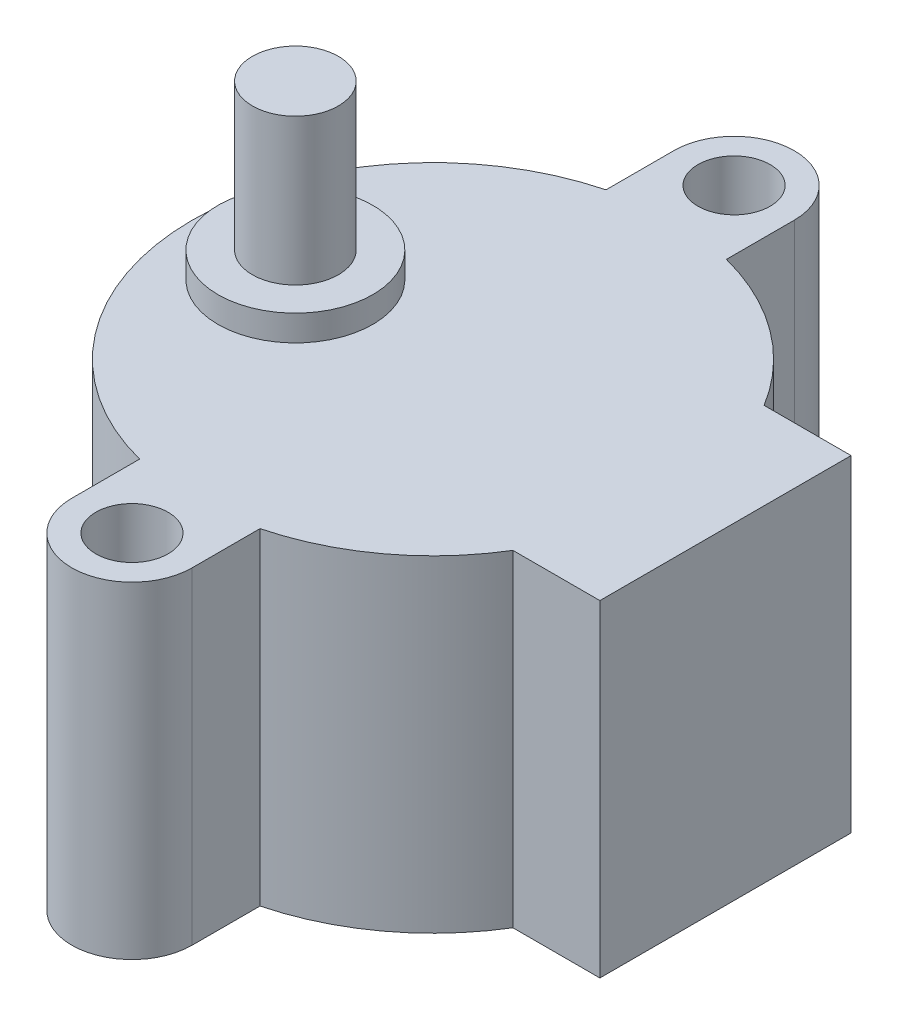
ISO-10303-21;
HEADER;
FILE_DESCRIPTION(('STEP AP214'),'2;1');
FILE_NAME('part.step','',(''),(''),'','','');
FILE_SCHEMA(('AUTOMOTIVE_DESIGN { 1 0 10303 214 1 1 1 1 }'));
ENDSEC;
DATA;
#1=APPLICATION_CONTEXT('core data for automotive mechanical design processes');
#2=APPLICATION_PROTOCOL_DEFINITION('international standard','automotive_design',2000,#1);
#3=PRODUCT_CONTEXT('',#1,'mechanical');
#4=PRODUCT('Part','Part','',(#3));
#5=PRODUCT_RELATED_PRODUCT_CATEGORY('part','',(#4));
#6=PRODUCT_DEFINITION_FORMATION('','',#4);
#7=PRODUCT_DEFINITION_CONTEXT('part definition',#1,'design');
#8=PRODUCT_DEFINITION('design','',#6,#7);
#9=PRODUCT_DEFINITION_SHAPE('','',#8);
#10=(LENGTH_UNIT() NAMED_UNIT(*) SI_UNIT(.MILLI.,.METRE.));
#11=(NAMED_UNIT(*) PLANE_ANGLE_UNIT() SI_UNIT($,.RADIAN.));
#12=(NAMED_UNIT(*) SI_UNIT($,.STERADIAN.) SOLID_ANGLE_UNIT());
#13=UNCERTAINTY_MEASURE_WITH_UNIT(LENGTH_MEASURE(1.E-05),#10,'distance_accuracy_value','');
#14=(GEOMETRIC_REPRESENTATION_CONTEXT(3) GLOBAL_UNCERTAINTY_ASSIGNED_CONTEXT((#13)) GLOBAL_UNIT_ASSIGNED_CONTEXT((#10,
#11,#12)) REPRESENTATION_CONTEXT('',''));
#15=CARTESIAN_POINT('',(0.,0.,0.));
#16=DIRECTION('',(0.,0.,1.));
#17=DIRECTION('',(1.,0.,0.));
#18=AXIS2_PLACEMENT_3D('',#15,#16,#17);
#19=CARTESIAN_POINT('',(0.,-19.,0.));
#20=DIRECTION('',(0.,1.,0.));
#21=DIRECTION('',(0.,0.,1.));
#22=AXIS2_PLACEMENT_3D('',#19,#20,#21);
#23=CYLINDRICAL_SURFACE('',#22,14.);
#24=CARTESIAN_POINT('',(0.,0.,0.));
#25=DIRECTION('',(0.,1.,0.));
#26=DIRECTION('',(0.,0.,1.));
#27=AXIS2_PLACEMENT_3D('',#24,#25,#26);
#28=CIRCLE('',#27,14.);
#29=CARTESIAN_POINT('',(-3.50000000000001,0.,-13.555441711726));
#30=VERTEX_POINT('',#29);
#31=CARTESIAN_POINT('',(-3.50000000000001,0.,13.555441711726));
#32=VERTEX_POINT('',#31);
#33=EDGE_CURVE('E185',#30,#32,#28,.T.);
#34=ORIENTED_EDGE('',*,*,#33,.F.);
#35=DIRECTION('',(0.,1.,0.));
#36=VECTOR('',#35,1.);
#37=CARTESIAN_POINT('',(-3.50000000000001,-19.,-13.555441711726));
#38=LINE('',#37,#36);
#39=CARTESIAN_POINT('',(-3.50000000000001,-19.,-13.555441711726));
#40=VERTEX_POINT('',#39);
#41=EDGE_CURVE('E52',#40,#30,#38,.T.);
#42=ORIENTED_EDGE('',*,*,#41,.F.);
#43=CARTESIAN_POINT('',(0.,-19.,0.));
#44=DIRECTION('',(0.,1.,0.));
#45=DIRECTION('',(0.,0.,1.));
#46=AXIS2_PLACEMENT_3D('',#43,#44,#45);
#47=CIRCLE('',#46,14.);
#48=CARTESIAN_POINT('',(-3.50000000000001,-19.,13.555441711726));
#49=VERTEX_POINT('',#48);
#50=EDGE_CURVE('E230',#40,#49,#47,.T.);
#51=ORIENTED_EDGE('',*,*,#50,.T.);
#52=DIRECTION('',(0.,1.,0.));
#53=VECTOR('',#52,1.);
#54=CARTESIAN_POINT('',(-3.50000000000001,-19.,13.555441711726));
#55=LINE('',#54,#53);
#56=EDGE_CURVE('E46',#49,#32,#55,.T.);
#57=ORIENTED_EDGE('',*,*,#56,.T.);
#58=EDGE_LOOP('',(#34,#42,#51,#57));
#59=FACE_BOUND('',#58,.T.);
#60=ADVANCED_FACE('F43',(#59),#23,.T.);
#61=CARTESIAN_POINT('',(-3.50000000000001,-19.,0.));
#62=DIRECTION('',(1.,0.,0.));
#63=DIRECTION('',(0.,0.,-1.));
#64=AXIS2_PLACEMENT_3D('',#61,#62,#63);
#65=PLANE('',#64);
#66=DIRECTION('',(0.,0.,-1.));
#67=VECTOR('',#66,1.);
#68=CARTESIAN_POINT('',(-3.50000000000001,0.,0.));
#69=LINE('',#68,#67);
#70=CARTESIAN_POINT('',(-3.50000000000001,0.,-17.5));
#71=VERTEX_POINT('',#70);
#72=EDGE_CURVE('E219',#30,#71,#69,.T.);
#73=ORIENTED_EDGE('',*,*,#72,.T.);
#74=DIRECTION('',(0.,1.,0.));
#75=VECTOR('',#74,1.);
#76=CARTESIAN_POINT('',(-3.50000000000001,-19.,-17.5));
#77=LINE('',#76,#75);
#78=CARTESIAN_POINT('',(-3.50000000000001,-19.,-17.5));
#79=VERTEX_POINT('',#78);
#80=EDGE_CURVE('E107',#79,#71,#77,.T.);
#81=ORIENTED_EDGE('',*,*,#80,.F.);
#82=DIRECTION('',(0.,0.,-1.));
#83=VECTOR('',#82,1.);
#84=CARTESIAN_POINT('',(-3.50000000000001,-19.,0.));
#85=LINE('',#84,#83);
#86=EDGE_CURVE('E166',#40,#79,#85,.T.);
#87=ORIENTED_EDGE('',*,*,#86,.F.);
#88=ORIENTED_EDGE('',*,*,#41,.T.);
#89=EDGE_LOOP('',(#73,#81,#87,#88));
#90=FACE_BOUND('',#89,.T.);
#91=ADVANCED_FACE('F258',(#90),#65,.F.);
#92=CARTESIAN_POINT('',(0.,-19.,-17.5));
#93=DIRECTION('',(0.,1.,0.));
#94=DIRECTION('',(0.,0.,1.));
#95=AXIS2_PLACEMENT_3D('',#92,#93,#94);
#96=CYLINDRICAL_SURFACE('',#95,3.50000000000001);
#97=CARTESIAN_POINT('',(0.,0.,-17.5));
#98=DIRECTION('',(0.,1.,0.));
#99=DIRECTION('',(0.,0.,1.));
#100=AXIS2_PLACEMENT_3D('',#97,#98,#99);
#101=CIRCLE('',#100,3.50000000000001);
#102=CARTESIAN_POINT('',(3.5,0.,-17.5));
#103=VERTEX_POINT('',#102);
#104=EDGE_CURVE('E152',#103,#71,#101,.T.);
#105=ORIENTED_EDGE('',*,*,#104,.F.);
#106=DIRECTION('',(0.,1.,0.));
#107=VECTOR('',#106,1.);
#108=CARTESIAN_POINT('',(3.5,-19.,-17.5));
#109=LINE('',#108,#107);
#110=CARTESIAN_POINT('',(3.5,-19.,-17.5));
#111=VERTEX_POINT('',#110);
#112=EDGE_CURVE('E147',#111,#103,#109,.T.);
#113=ORIENTED_EDGE('',*,*,#112,.F.);
#114=CARTESIAN_POINT('',(0.,-19.,-17.5));
#115=DIRECTION('',(0.,1.,0.));
#116=DIRECTION('',(0.,0.,1.));
#117=AXIS2_PLACEMENT_3D('',#114,#115,#116);
#118=CIRCLE('',#117,3.50000000000001);
#119=EDGE_CURVE('E150',#111,#79,#118,.T.);
#120=ORIENTED_EDGE('',*,*,#119,.T.);
#121=ORIENTED_EDGE('',*,*,#80,.T.);
#122=EDGE_LOOP('',(#105,#113,#120,#121));
#123=FACE_BOUND('',#122,.T.);
#124=ADVANCED_FACE('F149',(#123),#96,.T.);
#125=CARTESIAN_POINT('',(3.5,-19.,0.));
#126=DIRECTION('',(1.,0.,0.));
#127=DIRECTION('',(0.,0.,-1.));
#128=AXIS2_PLACEMENT_3D('',#125,#126,#127);
#129=PLANE('',#128);
#130=DIRECTION('',(0.,0.,-1.));
#131=VECTOR('',#130,1.);
#132=CARTESIAN_POINT('',(3.5,0.,0.));
#133=LINE('',#132,#131);
#134=CARTESIAN_POINT('',(3.5,0.,-13.555441711726));
#135=VERTEX_POINT('',#134);
#136=EDGE_CURVE('E214',#135,#103,#133,.T.);
#137=ORIENTED_EDGE('',*,*,#136,.F.);
#138=DIRECTION('',(0.,1.,0.));
#139=VECTOR('',#138,1.);
#140=CARTESIAN_POINT('',(3.5,-19.,-13.555441711726));
#141=LINE('',#140,#139);
#142=CARTESIAN_POINT('',(3.5,-19.,-13.555441711726));
#143=VERTEX_POINT('',#142);
#144=EDGE_CURVE('E158',#143,#135,#141,.T.);
#145=ORIENTED_EDGE('',*,*,#144,.F.);
#146=DIRECTION('',(0.,0.,-1.));
#147=VECTOR('',#146,1.);
#148=CARTESIAN_POINT('',(3.5,-19.,0.));
#149=LINE('',#148,#147);
#150=EDGE_CURVE('E164',#143,#111,#149,.T.);
#151=ORIENTED_EDGE('',*,*,#150,.T.);
#152=ORIENTED_EDGE('',*,*,#112,.T.);
#153=EDGE_LOOP('',(#137,#145,#151,#152));
#154=FACE_BOUND('',#153,.T.);
#155=ADVANCED_FACE('F168',(#154),#129,.T.);
#156=CARTESIAN_POINT('',(0.,-19.,0.));
#157=DIRECTION('',(0.,1.,0.));
#158=DIRECTION('',(0.,0.,1.));
#159=AXIS2_PLACEMENT_3D('',#156,#157,#158);
#160=CYLINDRICAL_SURFACE('',#159,14.);
#161=CARTESIAN_POINT('',(0.,0.,0.));
#162=DIRECTION('',(0.,1.,0.));
#163=DIRECTION('',(0.,0.,1.));
#164=AXIS2_PLACEMENT_3D('',#161,#162,#163);
#165=CIRCLE('',#164,14.);
#166=CARTESIAN_POINT('',(11.9461290801665,0.,-7.3));
#167=VERTEX_POINT('',#166);
#168=EDGE_CURVE('E206',#167,#135,#165,.T.);
#169=ORIENTED_EDGE('',*,*,#168,.F.);
#170=DIRECTION('',(0.,1.,0.));
#171=VECTOR('',#170,1.);
#172=CARTESIAN_POINT('',(11.9461290801665,-19.,-7.3));
#173=LINE('',#172,#171);
#174=CARTESIAN_POINT('',(11.9461290801665,-19.,-7.3));
#175=VERTEX_POINT('',#174);
#176=EDGE_CURVE('E236',#175,#167,#173,.T.);
#177=ORIENTED_EDGE('',*,*,#176,.F.);
#178=CARTESIAN_POINT('',(0.,-19.,0.));
#179=DIRECTION('',(0.,1.,0.));
#180=DIRECTION('',(0.,0.,1.));
#181=AXIS2_PLACEMENT_3D('',#178,#179,#180);
#182=CIRCLE('',#181,14.);
#183=EDGE_CURVE('E169',#175,#143,#182,.T.);
#184=ORIENTED_EDGE('',*,*,#183,.T.);
#185=ORIENTED_EDGE('',*,*,#144,.T.);
#186=EDGE_LOOP('',(#169,#177,#184,#185));
#187=FACE_BOUND('',#186,.T.);
#188=ADVANCED_FACE('F305',(#187),#160,.T.);
#189=CARTESIAN_POINT('',(0.,-19.,-7.3));
#190=DIRECTION('',(0.,0.,1.));
#191=DIRECTION('',(1.,0.,0.));
#192=AXIS2_PLACEMENT_3D('',#189,#190,#191);
#193=PLANE('',#192);
#194=DIRECTION('',(1.,0.,0.));
#195=VECTOR('',#194,1.);
#196=CARTESIAN_POINT('',(0.,0.,-7.3));
#197=LINE('',#196,#195);
#198=CARTESIAN_POINT('',(17.,0.,-7.3));
#199=VERTEX_POINT('',#198);
#200=EDGE_CURVE('E212',#167,#199,#197,.T.);
#201=ORIENTED_EDGE('',*,*,#200,.T.);
#202=DIRECTION('',(0.,1.,0.));
#203=VECTOR('',#202,1.);
#204=CARTESIAN_POINT('',(17.,-19.,-7.3));
#205=LINE('',#204,#203);
#206=CARTESIAN_POINT('',(17.,-19.,-7.3));
#207=VERTEX_POINT('',#206);
#208=EDGE_CURVE('E238',#207,#199,#205,.T.);
#209=ORIENTED_EDGE('',*,*,#208,.F.);
#210=DIRECTION('',(1.,0.,0.));
#211=VECTOR('',#210,1.);
#212=CARTESIAN_POINT('',(0.,-19.,-7.3));
#213=LINE('',#212,#211);
#214=EDGE_CURVE('E171',#175,#207,#213,.T.);
#215=ORIENTED_EDGE('',*,*,#214,.F.);
#216=ORIENTED_EDGE('',*,*,#176,.T.);
#217=EDGE_LOOP('',(#201,#209,#215,#216));
#218=FACE_BOUND('',#217,.T.);
#219=ADVANCED_FACE('F284',(#218),#193,.F.);
#220=CARTESIAN_POINT('',(17.,-19.,0.));
#221=DIRECTION('',(-1.,0.,0.));
#222=DIRECTION('',(0.,0.,1.));
#223=AXIS2_PLACEMENT_3D('',#220,#221,#222);
#224=PLANE('',#223);
#225=DIRECTION('',(0.,0.,1.));
#226=VECTOR('',#225,1.);
#227=CARTESIAN_POINT('',(17.,0.,0.));
#228=LINE('',#227,#226);
#229=CARTESIAN_POINT('',(17.,0.,7.3));
#230=VERTEX_POINT('',#229);
#231=EDGE_CURVE('E209',#199,#230,#228,.T.);
#232=ORIENTED_EDGE('',*,*,#231,.T.);
#233=DIRECTION('',(0.,1.,0.));
#234=VECTOR('',#233,1.);
#235=CARTESIAN_POINT('',(17.,-19.,7.3));
#236=LINE('',#235,#234);
#237=CARTESIAN_POINT('',(17.,-19.,7.3));
#238=VERTEX_POINT('',#237);
#239=EDGE_CURVE('E241',#238,#230,#236,.T.);
#240=ORIENTED_EDGE('',*,*,#239,.F.);
#241=DIRECTION('',(0.,0.,1.));
#242=VECTOR('',#241,1.);
#243=CARTESIAN_POINT('',(17.,-19.,0.));
#244=LINE('',#243,#242);
#245=EDGE_CURVE('E277',#207,#238,#244,.T.);
#246=ORIENTED_EDGE('',*,*,#245,.F.);
#247=ORIENTED_EDGE('',*,*,#208,.T.);
#248=EDGE_LOOP('',(#232,#240,#246,#247));
#249=FACE_BOUND('',#248,.T.);
#250=ADVANCED_FACE('F288',(#249),#224,.F.);
#251=CARTESIAN_POINT('',(0.,-19.,7.3));
#252=DIRECTION('',(0.,0.,1.));
#253=DIRECTION('',(1.,0.,0.));
#254=AXIS2_PLACEMENT_3D('',#251,#252,#253);
#255=PLANE('',#254);
#256=DIRECTION('',(1.,0.,0.));
#257=VECTOR('',#256,1.);
#258=CARTESIAN_POINT('',(0.,0.,7.3));
#259=LINE('',#258,#257);
#260=CARTESIAN_POINT('',(11.9461290801665,0.,7.3));
#261=VERTEX_POINT('',#260);
#262=EDGE_CURVE('E205',#261,#230,#259,.T.);
#263=ORIENTED_EDGE('',*,*,#262,.F.);
#264=DIRECTION('',(0.,1.,0.));
#265=VECTOR('',#264,1.);
#266=CARTESIAN_POINT('',(11.9461290801665,-19.,7.3));
#267=LINE('',#266,#265);
#268=CARTESIAN_POINT('',(11.9461290801665,-19.,7.3));
#269=VERTEX_POINT('',#268);
#270=EDGE_CURVE('E243',#269,#261,#267,.T.);
#271=ORIENTED_EDGE('',*,*,#270,.F.);
#272=DIRECTION('',(1.,0.,0.));
#273=VECTOR('',#272,1.);
#274=CARTESIAN_POINT('',(0.,-19.,7.3));
#275=LINE('',#274,#273);
#276=EDGE_CURVE('E275',#269,#238,#275,.T.);
#277=ORIENTED_EDGE('',*,*,#276,.T.);
#278=ORIENTED_EDGE('',*,*,#239,.T.);
#279=EDGE_LOOP('',(#263,#271,#277,#278));
#280=FACE_BOUND('',#279,.T.);
#281=ADVANCED_FACE('F291',(#280),#255,.T.);
#282=CARTESIAN_POINT('',(3.5,0.,13.555441711726));
#283=VERTEX_POINT('',#282);
#284=EDGE_CURVE('E201',#283,#261,#165,.T.);
#285=ORIENTED_EDGE('',*,*,#284,.F.);
#286=DIRECTION('',(0.,1.,0.));
#287=VECTOR('',#286,1.);
#288=CARTESIAN_POINT('',(3.5,-19.,13.555441711726));
#289=LINE('',#288,#287);
#290=CARTESIAN_POINT('',(3.5,-19.,13.555441711726));
#291=VERTEX_POINT('',#290);
#292=EDGE_CURVE('E245',#291,#283,#289,.T.);
#293=ORIENTED_EDGE('',*,*,#292,.F.);
#294=EDGE_CURVE('E173',#291,#269,#182,.T.);
#295=ORIENTED_EDGE('',*,*,#294,.T.);
#296=ORIENTED_EDGE('',*,*,#270,.T.);
#297=EDGE_LOOP('',(#285,#293,#295,#296));
#298=FACE_BOUND('',#297,.T.);
#299=ADVANCED_FACE('F296',(#298),#160,.T.);
#300=CARTESIAN_POINT('',(3.5,-19.,0.));
#301=DIRECTION('',(1.,0.,0.));
#302=DIRECTION('',(0.,0.,-1.));
#303=AXIS2_PLACEMENT_3D('',#300,#301,#302);
#304=PLANE('',#303);
#305=DIRECTION('',(0.,0.,-1.));
#306=VECTOR('',#305,1.);
#307=CARTESIAN_POINT('',(3.5,0.,0.));
#308=LINE('',#307,#306);
#309=CARTESIAN_POINT('',(3.50000000000001,0.,17.5));
#310=VERTEX_POINT('',#309);
#311=EDGE_CURVE('E197',#310,#283,#308,.T.);
#312=ORIENTED_EDGE('',*,*,#311,.F.);
#313=DIRECTION('',(0.,1.,0.));
#314=VECTOR('',#313,1.);
#315=CARTESIAN_POINT('',(3.50000000000001,-19.,17.5));
#316=LINE('',#315,#314);
#317=CARTESIAN_POINT('',(3.50000000000001,-19.,17.5));
#318=VERTEX_POINT('',#317);
#319=EDGE_CURVE('E248',#318,#310,#316,.T.);
#320=ORIENTED_EDGE('',*,*,#319,.F.);
#321=DIRECTION('',(0.,0.,-1.));
#322=VECTOR('',#321,1.);
#323=CARTESIAN_POINT('',(3.5,-19.,0.));
#324=LINE('',#323,#322);
#325=EDGE_CURVE('E269',#318,#291,#324,.T.);
#326=ORIENTED_EDGE('',*,*,#325,.T.);
#327=ORIENTED_EDGE('',*,*,#292,.T.);
#328=EDGE_LOOP('',(#312,#320,#326,#327));
#329=FACE_BOUND('',#328,.T.);
#330=ADVANCED_FACE('F299',(#329),#304,.T.);
#331=CARTESIAN_POINT('',(0.,-19.,17.5));
#332=DIRECTION('',(0.,1.,0.));
#333=DIRECTION('',(0.,0.,1.));
#334=AXIS2_PLACEMENT_3D('',#331,#332,#333);
#335=CYLINDRICAL_SURFACE('',#334,3.50000000000001);
#336=CARTESIAN_POINT('',(0.,0.,17.5));
#337=DIRECTION('',(0.,1.,0.));
#338=DIRECTION('',(0.,0.,1.));
#339=AXIS2_PLACEMENT_3D('',#336,#337,#338);
#340=CIRCLE('',#339,3.50000000000001);
#341=CARTESIAN_POINT('',(-3.50000000000001,0.,17.5));
#342=VERTEX_POINT('',#341);
#343=EDGE_CURVE('E193',#342,#310,#340,.T.);
#344=ORIENTED_EDGE('',*,*,#343,.F.);
#345=DIRECTION('',(0.,1.,0.));
#346=VECTOR('',#345,1.);
#347=CARTESIAN_POINT('',(-3.50000000000001,-19.,17.5));
#348=LINE('',#347,#346);
#349=CARTESIAN_POINT('',(-3.50000000000001,-19.,17.5));
#350=VERTEX_POINT('',#349);
#351=EDGE_CURVE('E250',#350,#342,#348,.T.);
#352=ORIENTED_EDGE('',*,*,#351,.F.);
#353=CARTESIAN_POINT('',(0.,-19.,17.5));
#354=DIRECTION('',(0.,1.,0.));
#355=DIRECTION('',(0.,0.,1.));
#356=AXIS2_PLACEMENT_3D('',#353,#354,#355);
#357=CIRCLE('',#356,3.50000000000001);
#358=EDGE_CURVE('E260',#350,#318,#357,.T.);
#359=ORIENTED_EDGE('',*,*,#358,.T.);
#360=ORIENTED_EDGE('',*,*,#319,.T.);
#361=EDGE_LOOP('',(#344,#352,#359,#360));
#362=FACE_BOUND('',#361,.T.);
#363=ADVANCED_FACE('F301',(#362),#335,.T.);
#364=CARTESIAN_POINT('',(0.,-19.,17.5));
#365=DIRECTION('',(0.,1.,0.));
#366=DIRECTION('',(0.,0.,1.));
#367=AXIS2_PLACEMENT_3D('',#364,#365,#366);
#368=CYLINDRICAL_SURFACE('',#367,2.1);
#369=CARTESIAN_POINT('',(0.,-19.,17.5));
#370=DIRECTION('',(0.,1.,0.));
#371=DIRECTION('',(0.,0.,1.));
#372=AXIS2_PLACEMENT_3D('',#369,#370,#371);
#373=CIRCLE('',#372,2.1);
#374=CARTESIAN_POINT('',(0.,-19.,19.6));
#375=VERTEX_POINT('',#374);
#376=EDGE_CURVE('E178',#375,#375,#373,.T.);
#377=ORIENTED_EDGE('',*,*,#376,.F.);
#378=EDGE_LOOP('',(#377));
#379=FACE_BOUND('',#378,.T.);
#380=CARTESIAN_POINT('',(0.,0.,17.5));
#381=DIRECTION('',(0.,1.,0.));
#382=DIRECTION('',(0.,0.,1.));
#383=AXIS2_PLACEMENT_3D('',#380,#381,#382);
#384=CIRCLE('',#383,2.1);
#385=CARTESIAN_POINT('',(0.,0.,19.6));
#386=VERTEX_POINT('',#385);
#387=EDGE_CURVE('E222',#386,#386,#384,.T.);
#388=ORIENTED_EDGE('',*,*,#387,.T.);
#389=EDGE_LOOP('',(#388));
#390=FACE_BOUND('',#389,.T.);
#391=ADVANCED_FACE('F325',(#379,#390),#368,.F.);
#392=CARTESIAN_POINT('',(-3.50000000000001,-19.,0.));
#393=DIRECTION('',(1.,0.,0.));
#394=DIRECTION('',(0.,0.,-1.));
#395=AXIS2_PLACEMENT_3D('',#392,#393,#394);
#396=PLANE('',#395);
#397=DIRECTION('',(0.,0.,-1.));
#398=VECTOR('',#397,1.);
#399=CARTESIAN_POINT('',(-3.50000000000001,0.,0.));
#400=LINE('',#399,#398);
#401=EDGE_CURVE('E189',#342,#32,#400,.T.);
#402=ORIENTED_EDGE('',*,*,#401,.T.);
#403=ORIENTED_EDGE('',*,*,#56,.F.);
#404=DIRECTION('',(0.,0.,-1.));
#405=VECTOR('',#404,1.);
#406=CARTESIAN_POINT('',(-3.50000000000001,-19.,0.));
#407=LINE('',#406,#405);
#408=EDGE_CURVE('E119',#350,#49,#407,.T.);
#409=ORIENTED_EDGE('',*,*,#408,.F.);
#410=ORIENTED_EDGE('',*,*,#351,.T.);
#411=EDGE_LOOP('',(#402,#403,#409,#410));
#412=FACE_BOUND('',#411,.T.);
#413=ADVANCED_FACE('F253',(#412),#396,.F.);
#414=CARTESIAN_POINT('',(0.,-19.,-17.5));
#415=DIRECTION('',(0.,1.,0.));
#416=DIRECTION('',(0.,0.,1.));
#417=AXIS2_PLACEMENT_3D('',#414,#415,#416);
#418=CYLINDRICAL_SURFACE('',#417,2.1);
#419=CARTESIAN_POINT('',(0.,-19.,-17.5));
#420=DIRECTION('',(0.,1.,0.));
#421=DIRECTION('',(0.,0.,1.));
#422=AXIS2_PLACEMENT_3D('',#419,#420,#421);
#423=CIRCLE('',#422,2.1);
#424=CARTESIAN_POINT('',(0.,-19.,-15.4));
#425=VERTEX_POINT('',#424);
#426=EDGE_CURVE('E182',#425,#425,#423,.T.);
#427=ORIENTED_EDGE('',*,*,#426,.F.);
#428=EDGE_LOOP('',(#427));
#429=FACE_BOUND('',#428,.T.);
#430=CARTESIAN_POINT('',(0.,0.,-17.5));
#431=DIRECTION('',(0.,1.,0.));
#432=DIRECTION('',(0.,0.,1.));
#433=AXIS2_PLACEMENT_3D('',#430,#431,#432);
#434=CIRCLE('',#433,2.1);
#435=CARTESIAN_POINT('',(0.,0.,-15.4));
#436=VERTEX_POINT('',#435);
#437=EDGE_CURVE('E226',#436,#436,#434,.T.);
#438=ORIENTED_EDGE('',*,*,#437,.T.);
#439=EDGE_LOOP('',(#438));
#440=FACE_BOUND('',#439,.T.);
#441=ADVANCED_FACE('F329',(#429,#440),#418,.F.);
#442=CARTESIAN_POINT('',(0.,-19.,0.));
#443=DIRECTION('',(0.,1.,0.));
#444=DIRECTION('',(0.,0.,1.));
#445=AXIS2_PLACEMENT_3D('',#442,#443,#444);
#446=PLANE('',#445);
#447=ORIENTED_EDGE('',*,*,#50,.F.);
#448=ORIENTED_EDGE('',*,*,#86,.T.);
#449=ORIENTED_EDGE('',*,*,#119,.F.);
#450=ORIENTED_EDGE('',*,*,#150,.F.);
#451=ORIENTED_EDGE('',*,*,#183,.F.);
#452=ORIENTED_EDGE('',*,*,#214,.T.);
#453=ORIENTED_EDGE('',*,*,#245,.T.);
#454=ORIENTED_EDGE('',*,*,#276,.F.);
#455=ORIENTED_EDGE('',*,*,#294,.F.);
#456=ORIENTED_EDGE('',*,*,#325,.F.);
#457=ORIENTED_EDGE('',*,*,#358,.F.);
#458=ORIENTED_EDGE('',*,*,#408,.T.);
#459=EDGE_LOOP('',(#447,#448,#449,#450,#451,#452,#453,#454,#455,#456,#457,#458));
#460=FACE_BOUND('',#459,.T.);
#461=ORIENTED_EDGE('',*,*,#376,.T.);
#462=EDGE_LOOP('',(#461));
#463=FACE_BOUND('',#462,.T.);
#464=ORIENTED_EDGE('',*,*,#426,.T.);
#465=EDGE_LOOP('',(#464));
#466=FACE_BOUND('',#465,.T.);
#467=ADVANCED_FACE('F161',(#460,#463,#466),#446,.F.);
#468=CARTESIAN_POINT('',(0.,0.,0.));
#469=DIRECTION('',(0.,1.,0.));
#470=DIRECTION('',(0.,0.,1.));
#471=AXIS2_PLACEMENT_3D('',#468,#469,#470);
#472=PLANE('',#471);
#473=CARTESIAN_POINT('',(-8.,0.,0.));
#474=DIRECTION('',(0.,1.,0.));
#475=DIRECTION('',(0.,0.,1.));
#476=AXIS2_PLACEMENT_3D('',#473,#474,#475);
#477=CIRCLE('',#476,4.5);
#478=CARTESIAN_POINT('',(-8.,0.,4.5));
#479=VERTEX_POINT('',#478);
#480=EDGE_CURVE('E263',#479,#479,#477,.T.);
#481=ORIENTED_EDGE('',*,*,#480,.F.);
#482=EDGE_LOOP('',(#481));
#483=FACE_BOUND('',#482,.T.);
#484=ORIENTED_EDGE('',*,*,#33,.T.);
#485=ORIENTED_EDGE('',*,*,#401,.F.);
#486=ORIENTED_EDGE('',*,*,#343,.T.);
#487=ORIENTED_EDGE('',*,*,#311,.T.);
#488=ORIENTED_EDGE('',*,*,#284,.T.);
#489=ORIENTED_EDGE('',*,*,#262,.T.);
#490=ORIENTED_EDGE('',*,*,#231,.F.);
#491=ORIENTED_EDGE('',*,*,#200,.F.);
#492=ORIENTED_EDGE('',*,*,#168,.T.);
#493=ORIENTED_EDGE('',*,*,#136,.T.);
#494=ORIENTED_EDGE('',*,*,#104,.T.);
#495=ORIENTED_EDGE('',*,*,#72,.F.);
#496=EDGE_LOOP('',(#484,#485,#486,#487,#488,#489,#490,#491,#492,#493,#494,#495));
#497=FACE_BOUND('',#496,.T.);
#498=ORIENTED_EDGE('',*,*,#387,.F.);
#499=EDGE_LOOP('',(#498));
#500=FACE_BOUND('',#499,.T.);
#501=ORIENTED_EDGE('',*,*,#437,.F.);
#502=EDGE_LOOP('',(#501));
#503=FACE_BOUND('',#502,.T.);
#504=ADVANCED_FACE('F256',(#483,#497,#500,#503),#472,.T.);
#505=CARTESIAN_POINT('',(-8.,1.5,0.));
#506=DIRECTION('',(0.,-1.,0.));
#507=DIRECTION('',(0.,0.,-1.));
#508=AXIS2_PLACEMENT_3D('',#505,#506,#507);
#509=CYLINDRICAL_SURFACE('',#508,4.5);
#510=CARTESIAN_POINT('',(-8.,1.5,0.));
#511=DIRECTION('',(0.,1.,0.));
#512=DIRECTION('',(0.,0.,1.));
#513=AXIS2_PLACEMENT_3D('',#510,#511,#512);
#514=CIRCLE('',#513,4.5);
#515=CARTESIAN_POINT('',(-8.,1.5,4.5));
#516=VERTEX_POINT('',#515);
#517=EDGE_CURVE('E190',#516,#516,#514,.T.);
#518=ORIENTED_EDGE('',*,*,#517,.F.);
#519=EDGE_LOOP('',(#518));
#520=FACE_BOUND('',#519,.T.);
#521=ORIENTED_EDGE('',*,*,#480,.T.);
#522=EDGE_LOOP('',(#521));
#523=FACE_BOUND('',#522,.T.);
#524=ADVANCED_FACE('F335',(#520,#523),#509,.T.);
#525=CARTESIAN_POINT('',(-8.,1.5,0.));
#526=DIRECTION('',(0.,1.,0.));
#527=DIRECTION('',(0.,0.,1.));
#528=AXIS2_PLACEMENT_3D('',#525,#526,#527);
#529=PLANE('',#528);
#530=CARTESIAN_POINT('',(-8.,1.5,0.));
#531=DIRECTION('',(0.,1.,0.));
#532=DIRECTION('',(0.,0.,1.));
#533=AXIS2_PLACEMENT_3D('',#530,#531,#532);
#534=CIRCLE('',#533,2.5);
#535=CARTESIAN_POINT('',(-8.,1.5,2.5));
#536=VERTEX_POINT('',#535);
#537=EDGE_CURVE('E11',#536,#536,#534,.T.);
#538=ORIENTED_EDGE('',*,*,#537,.F.);
#539=EDGE_LOOP('',(#538));
#540=FACE_BOUND('',#539,.T.);
#541=ORIENTED_EDGE('',*,*,#517,.T.);
#542=EDGE_LOOP('',(#541));
#543=FACE_BOUND('',#542,.T.);
#544=ADVANCED_FACE('F341',(#540,#543),#529,.T.);
#545=CARTESIAN_POINT('',(-8.,10.,0.));
#546=DIRECTION('',(0.,-1.,0.));
#547=DIRECTION('',(0.,0.,-1.));
#548=AXIS2_PLACEMENT_3D('',#545,#546,#547);
#549=CYLINDRICAL_SURFACE('',#548,2.5);
#550=CARTESIAN_POINT('',(-8.,10.,0.));
#551=DIRECTION('',(0.,1.,0.));
#552=DIRECTION('',(0.,0.,1.));
#553=AXIS2_PLACEMENT_3D('',#550,#551,#552);
#554=CIRCLE('',#553,2.5);
#555=CARTESIAN_POINT('',(-8.,10.,2.5));
#556=VERTEX_POINT('',#555);
#557=EDGE_CURVE('E357',#556,#556,#554,.T.);
#558=ORIENTED_EDGE('',*,*,#557,.F.);
#559=EDGE_LOOP('',(#558));
#560=FACE_BOUND('',#559,.T.);
#561=ORIENTED_EDGE('',*,*,#537,.T.);
#562=EDGE_LOOP('',(#561));
#563=FACE_BOUND('',#562,.T.);
#564=ADVANCED_FACE('F345',(#560,#563),#549,.T.);
#565=CARTESIAN_POINT('',(-8.,10.,0.));
#566=DIRECTION('',(0.,1.,0.));
#567=DIRECTION('',(0.,0.,1.));
#568=AXIS2_PLACEMENT_3D('',#565,#566,#567);
#569=PLANE('',#568);
#570=ORIENTED_EDGE('',*,*,#557,.T.);
#571=EDGE_LOOP('',(#570));
#572=FACE_BOUND('',#571,.T.);
#573=ADVANCED_FACE('F349',(#572),#569,.T.);
#574=CLOSED_SHELL('',(#60,#91,#124,#155,#188,#219,#250,#281,#299,#330,#363,#391,#413,#441,#467,
#504,#524,#544,#564,#573));
#575=MANIFOLD_SOLID_BREP('B2',#574);
#576=ADVANCED_BREP_SHAPE_REPRESENTATION('',(#18,#575),#14);
#577=SHAPE_DEFINITION_REPRESENTATION(#9,#576);
ENDSEC;
END-ISO-10303-21;
